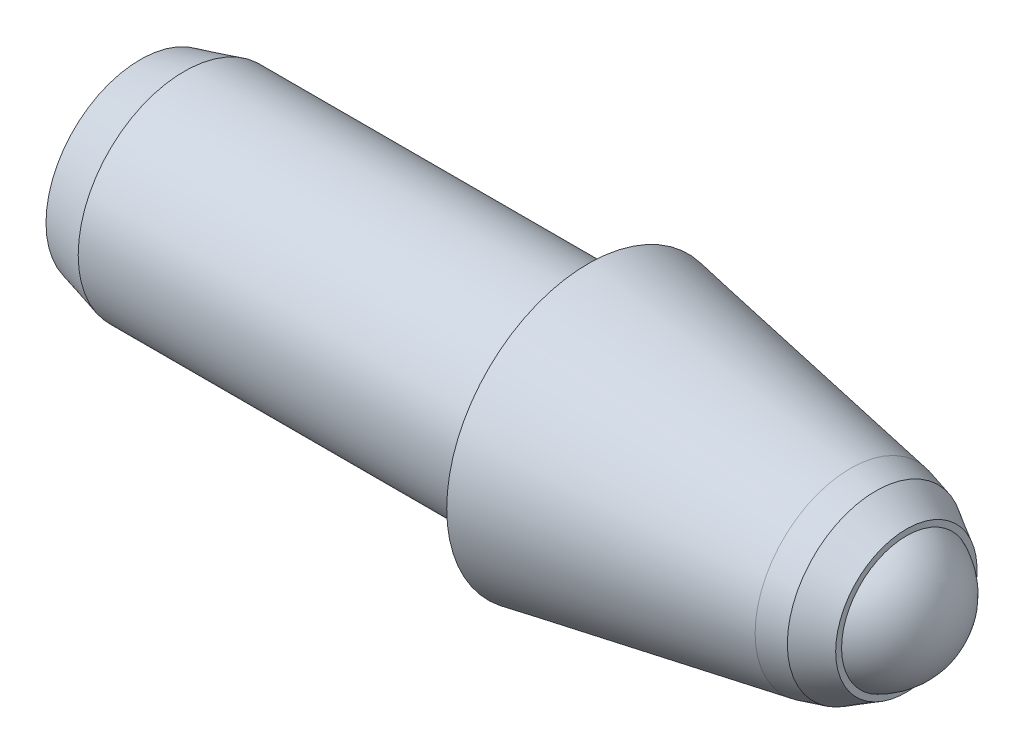
ISO-10303-21;
HEADER;
FILE_DESCRIPTION(('STEP AP214'),'2;1');
FILE_NAME('part.step','',(''),(''),'','','');
FILE_SCHEMA(('AUTOMOTIVE_DESIGN { 1 0 10303 214 1 1 1 1 }'));
ENDSEC;
DATA;
#1=APPLICATION_CONTEXT('core data for automotive mechanical design processes');
#2=APPLICATION_PROTOCOL_DEFINITION('international standard','automotive_design',2000,#1);
#3=PRODUCT_CONTEXT('',#1,'mechanical');
#4=PRODUCT('Part','Part','',(#3));
#5=PRODUCT_RELATED_PRODUCT_CATEGORY('part','',(#4));
#6=PRODUCT_DEFINITION_FORMATION('','',#4);
#7=PRODUCT_DEFINITION_CONTEXT('part definition',#1,'design');
#8=PRODUCT_DEFINITION('design','',#6,#7);
#9=PRODUCT_DEFINITION_SHAPE('','',#8);
#10=(LENGTH_UNIT() NAMED_UNIT(*) SI_UNIT(.MILLI.,.METRE.));
#11=(NAMED_UNIT(*) PLANE_ANGLE_UNIT() SI_UNIT($,.RADIAN.));
#12=(NAMED_UNIT(*) SI_UNIT($,.STERADIAN.) SOLID_ANGLE_UNIT());
#13=UNCERTAINTY_MEASURE_WITH_UNIT(LENGTH_MEASURE(1.E-05),#10,'distance_accuracy_value','');
#14=(GEOMETRIC_REPRESENTATION_CONTEXT(3) GLOBAL_UNCERTAINTY_ASSIGNED_CONTEXT((#13)) GLOBAL_UNIT_ASSIGNED_CONTEXT((#10,
#11,#12)) REPRESENTATION_CONTEXT('',''));
#15=CARTESIAN_POINT('',(0.,0.,0.));
#16=DIRECTION('',(0.,0.,1.));
#17=DIRECTION('',(1.,0.,0.));
#18=AXIS2_PLACEMENT_3D('',#15,#16,#17);
#19=CARTESIAN_POINT('',(6.26,0.,0.));
#20=DIRECTION('',(-1.,0.,0.));
#21=DIRECTION('',(0.,1.,0.));
#22=AXIS2_PLACEMENT_3D('',#19,#20,#21);
#23=SPHERICAL_SURFACE('',#22,0.6);
#24=CARTESIAN_POINT('',(5.66,0.,0.));
#25=VERTEX_POINT('',#24);
#26=VERTEX_LOOP('',#25);
#27=FACE_BOUND('',#26,.T.);
#28=ADVANCED_FACE('F52',(#27),#23,.T.);
#29=CLOSED_SHELL('',(#28));
#30=MANIFOLD_SOLID_BREP('B2',#29);
#31=CARTESIAN_POINT('',(6.02441020488491,0.,0.));
#32=DIRECTION('',(-1.,0.,0.));
#33=DIRECTION('',(0.,0.,1.));
#34=AXIS2_PLACEMENT_3D('',#31,#32,#33);
#35=CONICAL_SURFACE('',#34,0.807776464715544,0.174532925199433);
#36=CARTESIAN_POINT('',(3.8,0.,0.));
#37=DIRECTION('',(-1.,0.,0.));
#38=DIRECTION('',(0.,0.,1.));
#39=AXIS2_PLACEMENT_3D('',#36,#37,#38);
#40=CIRCLE('',#39,1.2);
#41=CARTESIAN_POINT('',(3.8,0.,1.2));
#42=VERTEX_POINT('',#41);
#43=EDGE_CURVE('E51',#42,#42,#40,.T.);
#44=ORIENTED_EDGE('',*,*,#43,.F.);
#45=EDGE_LOOP('',(#44));
#46=FACE_BOUND('',#45,.T.);
#47=CARTESIAN_POINT('',(6.02441020488491,0.,0.));
#48=DIRECTION('',(-1.,0.,0.));
#49=DIRECTION('',(0.,0.,1.));
#50=AXIS2_PLACEMENT_3D('',#47,#48,#49);
#51=CIRCLE('',#50,0.807776464715544);
#52=CARTESIAN_POINT('',(6.02441020488491,0.,0.807776464715544));
#53=VERTEX_POINT('',#52);
#54=EDGE_CURVE('E149',#53,#53,#51,.T.);
#55=ORIENTED_EDGE('',*,*,#54,.T.);
#56=EDGE_LOOP('',(#55));
#57=FACE_BOUND('',#56,.T.);
#58=ADVANCED_FACE('F72',(#46,#57),#35,.T.);
#59=CARTESIAN_POINT('',(3.8,0.9,0.));
#60=DIRECTION('',(1.,0.,0.));
#61=DIRECTION('',(0.,0.,-1.));
#62=AXIS2_PLACEMENT_3D('',#59,#60,#61);
#63=PLANE('',#62);
#64=CARTESIAN_POINT('',(3.8,0.,0.));
#65=DIRECTION('',(-1.,0.,0.));
#66=DIRECTION('',(0.,0.,1.));
#67=AXIS2_PLACEMENT_3D('',#64,#65,#66);
#68=CIRCLE('',#67,0.9);
#69=CARTESIAN_POINT('',(3.8,0.,0.9));
#70=VERTEX_POINT('',#69);
#71=EDGE_CURVE('E79',#70,#70,#68,.T.);
#72=ORIENTED_EDGE('',*,*,#71,.F.);
#73=EDGE_LOOP('',(#72));
#74=FACE_BOUND('',#73,.T.);
#75=ORIENTED_EDGE('',*,*,#43,.T.);
#76=EDGE_LOOP('',(#75));
#77=FACE_BOUND('',#76,.T.);
#78=ADVANCED_FACE('F248',(#74,#77),#63,.F.);
#79=CARTESIAN_POINT('',(-0.1578843458274,0.,0.));
#80=DIRECTION('',(-1.,0.,0.));
#81=DIRECTION('',(0.,0.,1.));
#82=AXIS2_PLACEMENT_3D('',#79,#80,#81);
#83=CYLINDRICAL_SURFACE('',#82,0.9);
#84=CARTESIAN_POINT('',(0.373205080756895,0.,0.));
#85=DIRECTION('',(-1.,0.,0.));
#86=DIRECTION('',(0.,0.,1.));
#87=AXIS2_PLACEMENT_3D('',#84,#85,#86);
#88=CIRCLE('',#87,0.9);
#89=CARTESIAN_POINT('',(0.373205080756895,0.,0.9));
#90=VERTEX_POINT('',#89);
#91=EDGE_CURVE('E85',#90,#90,#88,.T.);
#92=ORIENTED_EDGE('',*,*,#91,.F.);
#93=EDGE_LOOP('',(#92));
#94=FACE_BOUND('',#93,.T.);
#95=ORIENTED_EDGE('',*,*,#71,.T.);
#96=EDGE_LOOP('',(#95));
#97=FACE_BOUND('',#96,.T.);
#98=ADVANCED_FACE('F243',(#94,#97),#83,.T.);
#99=CARTESIAN_POINT('',(0.373205080756895,0.,0.));
#100=DIRECTION('',(1.,0.,0.));
#101=DIRECTION('',(0.,0.,-1.));
#102=AXIS2_PLACEMENT_3D('',#99,#100,#101);
#103=CONICAL_SURFACE('',#102,0.9,0.261799387799143);
#104=CARTESIAN_POINT('',(0.,0.,0.));
#105=DIRECTION('',(-1.,0.,0.));
#106=DIRECTION('',(0.,0.,1.));
#107=AXIS2_PLACEMENT_3D('',#104,#105,#106);
#108=CIRCLE('',#107,0.8);
#109=CARTESIAN_POINT('',(0.,0.,0.8));
#110=VERTEX_POINT('',#109);
#111=EDGE_CURVE('E91',#110,#110,#108,.T.);
#112=ORIENTED_EDGE('',*,*,#111,.F.);
#113=EDGE_LOOP('',(#112));
#114=FACE_BOUND('',#113,.T.);
#115=ORIENTED_EDGE('',*,*,#91,.T.);
#116=EDGE_LOOP('',(#115));
#117=FACE_BOUND('',#116,.T.);
#118=ADVANCED_FACE('F237',(#114,#117),#103,.T.);
#119=CARTESIAN_POINT('',(0.,0.465,0.));
#120=DIRECTION('',(1.,0.,0.));
#121=DIRECTION('',(0.,0.,-1.));
#122=AXIS2_PLACEMENT_3D('',#119,#120,#121);
#123=PLANE('',#122);
#124=CARTESIAN_POINT('',(0.,0.,0.));
#125=DIRECTION('',(-1.,0.,0.));
#126=DIRECTION('',(0.,0.,1.));
#127=AXIS2_PLACEMENT_3D('',#124,#125,#126);
#128=CIRCLE('',#127,0.465);
#129=CARTESIAN_POINT('',(0.,0.,0.465));
#130=VERTEX_POINT('',#129);
#131=EDGE_CURVE('E97',#130,#130,#128,.T.);
#132=ORIENTED_EDGE('',*,*,#131,.F.);
#133=EDGE_LOOP('',(#132));
#134=FACE_BOUND('',#133,.T.);
#135=ORIENTED_EDGE('',*,*,#111,.T.);
#136=EDGE_LOOP('',(#135));
#137=FACE_BOUND('',#136,.T.);
#138=ADVANCED_FACE('F231',(#134,#137),#123,.F.);
#139=CARTESIAN_POINT('',(-0.1578843458274,0.,0.));
#140=DIRECTION('',(-1.,0.,0.));
#141=DIRECTION('',(0.,0.,1.));
#142=AXIS2_PLACEMENT_3D('',#139,#140,#141);
#143=CYLINDRICAL_SURFACE('',#142,0.465);
#144=CARTESIAN_POINT('',(0.6,0.,0.));
#145=DIRECTION('',(-1.,0.,0.));
#146=DIRECTION('',(0.,0.,1.));
#147=AXIS2_PLACEMENT_3D('',#144,#145,#146);
#148=CIRCLE('',#147,0.465);
#149=CARTESIAN_POINT('',(0.6,0.,0.465));
#150=VERTEX_POINT('',#149);
#151=EDGE_CURVE('E101',#150,#150,#148,.T.);
#152=ORIENTED_EDGE('',*,*,#151,.F.);
#153=EDGE_LOOP('',(#152));
#154=FACE_BOUND('',#153,.T.);
#155=ORIENTED_EDGE('',*,*,#131,.T.);
#156=EDGE_LOOP('',(#155));
#157=FACE_BOUND('',#156,.T.);
#158=ADVANCED_FACE('F225',(#154,#157),#143,.F.);
#159=CARTESIAN_POINT('',(0.6,0.,0.));
#160=DIRECTION('',(-1.,0.,0.));
#161=DIRECTION('',(0.,0.,1.));
#162=AXIS2_PLACEMENT_3D('',#159,#160,#161);
#163=CONICAL_SURFACE('',#162,0.465,0.78539816339745);
#164=CARTESIAN_POINT('',(0.615,0.,0.));
#165=DIRECTION('',(-1.,0.,0.));
#166=DIRECTION('',(0.,0.,1.));
#167=AXIS2_PLACEMENT_3D('',#164,#165,#166);
#168=CIRCLE('',#167,0.45);
#169=CARTESIAN_POINT('',(0.615,0.,0.45));
#170=VERTEX_POINT('',#169);
#171=EDGE_CURVE('E105',#170,#170,#168,.T.);
#172=ORIENTED_EDGE('',*,*,#171,.F.);
#173=EDGE_LOOP('',(#172));
#174=FACE_BOUND('',#173,.T.);
#175=ORIENTED_EDGE('',*,*,#151,.T.);
#176=EDGE_LOOP('',(#175));
#177=FACE_BOUND('',#176,.T.);
#178=ADVANCED_FACE('F219',(#174,#177),#163,.F.);
#179=CARTESIAN_POINT('',(-0.1578843458274,0.,0.));
#180=DIRECTION('',(-1.,0.,0.));
#181=DIRECTION('',(0.,0.,1.));
#182=AXIS2_PLACEMENT_3D('',#179,#180,#181);
#183=CYLINDRICAL_SURFACE('',#182,0.45);
#184=CARTESIAN_POINT('',(3.,0.,0.));
#185=DIRECTION('',(-1.,0.,0.));
#186=DIRECTION('',(0.,0.,1.));
#187=AXIS2_PLACEMENT_3D('',#184,#185,#186);
#188=CIRCLE('',#187,0.45);
#189=CARTESIAN_POINT('',(3.,0.,0.45));
#190=VERTEX_POINT('',#189);
#191=EDGE_CURVE('E109',#190,#190,#188,.T.);
#192=ORIENTED_EDGE('',*,*,#191,.F.);
#193=EDGE_LOOP('',(#192));
#194=FACE_BOUND('',#193,.T.);
#195=ORIENTED_EDGE('',*,*,#171,.T.);
#196=EDGE_LOOP('',(#195));
#197=FACE_BOUND('',#196,.T.);
#198=ADVANCED_FACE('F213',(#194,#197),#183,.F.);
#199=CARTESIAN_POINT('',(3.,0.,0.));
#200=DIRECTION('',(-1.,0.,0.));
#201=DIRECTION('',(0.,0.,1.));
#202=AXIS2_PLACEMENT_3D('',#199,#200,#201);
#203=CONICAL_SURFACE('',#202,0.45,1.0471975511966);
#204=CARTESIAN_POINT('',(3.02886751345948,0.,0.));
#205=DIRECTION('',(-1.,0.,0.));
#206=DIRECTION('',(0.,0.,1.));
#207=AXIS2_PLACEMENT_3D('',#204,#205,#206);
#208=CIRCLE('',#207,0.4);
#209=CARTESIAN_POINT('',(3.02886751345948,0.,0.4));
#210=VERTEX_POINT('',#209);
#211=EDGE_CURVE('E113',#210,#210,#208,.T.);
#212=ORIENTED_EDGE('',*,*,#211,.F.);
#213=EDGE_LOOP('',(#212));
#214=FACE_BOUND('',#213,.T.);
#215=ORIENTED_EDGE('',*,*,#191,.T.);
#216=EDGE_LOOP('',(#215));
#217=FACE_BOUND('',#216,.T.);
#218=ADVANCED_FACE('F207',(#214,#217),#203,.F.);
#219=CARTESIAN_POINT('',(-0.1578843458274,0.,0.));
#220=DIRECTION('',(-1.,0.,0.));
#221=DIRECTION('',(0.,0.,1.));
#222=AXIS2_PLACEMENT_3D('',#219,#220,#221);
#223=CYLINDRICAL_SURFACE('',#222,0.4);
#224=CARTESIAN_POINT('',(5.,0.,0.));
#225=DIRECTION('',(-1.,0.,0.));
#226=DIRECTION('',(0.,0.,1.));
#227=AXIS2_PLACEMENT_3D('',#224,#225,#226);
#228=CIRCLE('',#227,0.4);
#229=CARTESIAN_POINT('',(5.,0.,0.4));
#230=VERTEX_POINT('',#229);
#231=EDGE_CURVE('E117',#230,#230,#228,.T.);
#232=ORIENTED_EDGE('',*,*,#231,.F.);
#233=EDGE_LOOP('',(#232));
#234=FACE_BOUND('',#233,.T.);
#235=ORIENTED_EDGE('',*,*,#211,.T.);
#236=EDGE_LOOP('',(#235));
#237=FACE_BOUND('',#236,.T.);
#238=ADVANCED_FACE('F201',(#234,#237),#223,.F.);
#239=CARTESIAN_POINT('',(5.,0.,0.));
#240=DIRECTION('',(-1.,0.,0.));
#241=DIRECTION('',(0.,0.,1.));
#242=AXIS2_PLACEMENT_3D('',#239,#240,#241);
#243=CONICAL_SURFACE('',#242,0.4,1.04719755119659);
#244=CARTESIAN_POINT('',(5.02886751345948,0.,0.));
#245=DIRECTION('',(-1.,0.,0.));
#246=DIRECTION('',(0.,0.,1.));
#247=AXIS2_PLACEMENT_3D('',#244,#245,#246);
#248=CIRCLE('',#247,0.35);
#249=CARTESIAN_POINT('',(5.02886751345948,0.,0.35));
#250=VERTEX_POINT('',#249);
#251=EDGE_CURVE('E121',#250,#250,#248,.T.);
#252=ORIENTED_EDGE('',*,*,#251,.F.);
#253=EDGE_LOOP('',(#252));
#254=FACE_BOUND('',#253,.T.);
#255=ORIENTED_EDGE('',*,*,#231,.T.);
#256=EDGE_LOOP('',(#255));
#257=FACE_BOUND('',#256,.T.);
#258=ADVANCED_FACE('F195',(#254,#257),#243,.F.);
#259=CARTESIAN_POINT('',(-0.1578843458274,0.,0.));
#260=DIRECTION('',(-1.,0.,0.));
#261=DIRECTION('',(0.,0.,1.));
#262=AXIS2_PLACEMENT_3D('',#259,#260,#261);
#263=CYLINDRICAL_SURFACE('',#262,0.35);
#264=CARTESIAN_POINT('',(5.76147186257614,0.,0.));
#265=DIRECTION('',(-1.,0.,0.));
#266=DIRECTION('',(0.,0.,1.));
#267=AXIS2_PLACEMENT_3D('',#264,#265,#266);
#268=CIRCLE('',#267,0.35);
#269=CARTESIAN_POINT('',(5.76147186257614,0.,0.35));
#270=VERTEX_POINT('',#269);
#271=EDGE_CURVE('E125',#270,#270,#268,.T.);
#272=ORIENTED_EDGE('',*,*,#271,.F.);
#273=EDGE_LOOP('',(#272));
#274=FACE_BOUND('',#273,.T.);
#275=ORIENTED_EDGE('',*,*,#251,.T.);
#276=EDGE_LOOP('',(#275));
#277=FACE_BOUND('',#276,.T.);
#278=ADVANCED_FACE('F189',(#274,#277),#263,.F.);
#279=CARTESIAN_POINT('',(5.76147186257614,0.,0.));
#280=DIRECTION('',(1.,0.,0.));
#281=DIRECTION('',(0.,0.,-1.));
#282=AXIS2_PLACEMENT_3D('',#279,#280,#281);
#283=CONICAL_SURFACE('',#282,0.35,0.785398163397444);
#284=CARTESIAN_POINT('',(6.01147186257614,0.,0.));
#285=DIRECTION('',(-1.,0.,0.));
#286=DIRECTION('',(0.,0.,1.));
#287=AXIS2_PLACEMENT_3D('',#284,#285,#286);
#288=CIRCLE('',#287,0.6);
#289=CARTESIAN_POINT('',(6.01147186257614,0.,0.6));
#290=VERTEX_POINT('',#289);
#291=EDGE_CURVE('E129',#290,#290,#288,.T.);
#292=ORIENTED_EDGE('',*,*,#291,.F.);
#293=EDGE_LOOP('',(#292));
#294=FACE_BOUND('',#293,.T.);
#295=ORIENTED_EDGE('',*,*,#271,.T.);
#296=EDGE_LOOP('',(#295));
#297=FACE_BOUND('',#296,.T.);
#298=ADVANCED_FACE('F183',(#294,#297),#283,.F.);
#299=CARTESIAN_POINT('',(-0.1578843458274,0.,0.));
#300=DIRECTION('',(-1.,0.,0.));
#301=DIRECTION('',(0.,0.,1.));
#302=AXIS2_PLACEMENT_3D('',#299,#300,#301);
#303=CYLINDRICAL_SURFACE('',#302,0.6);
#304=CARTESIAN_POINT('',(6.26,0.,0.));
#305=DIRECTION('',(-1.,0.,0.));
#306=DIRECTION('',(0.,0.,1.));
#307=AXIS2_PLACEMENT_3D('',#304,#305,#306);
#308=CIRCLE('',#307,0.6);
#309=CARTESIAN_POINT('',(6.26,0.,0.6));
#310=VERTEX_POINT('',#309);
#311=EDGE_CURVE('E133',#310,#310,#308,.T.);
#312=ORIENTED_EDGE('',*,*,#311,.F.);
#313=EDGE_LOOP('',(#312));
#314=FACE_BOUND('',#313,.T.);
#315=ORIENTED_EDGE('',*,*,#291,.T.);
#316=EDGE_LOOP('',(#315));
#317=FACE_BOUND('',#316,.T.);
#318=ADVANCED_FACE('F177',(#314,#317),#303,.F.);
#319=CARTESIAN_POINT('',(6.26,0.,0.));
#320=DIRECTION('',(-1.,0.,0.));
#321=DIRECTION('',(0.,1.,0.));
#322=AXIS2_PLACEMENT_3D('',#319,#320,#321);
#323=SPHERICAL_SURFACE('',#322,0.599999999999999);
#324=CARTESIAN_POINT('',(6.5,0.,0.));
#325=DIRECTION('',(-1.,0.,0.));
#326=DIRECTION('',(0.,0.,1.));
#327=AXIS2_PLACEMENT_3D('',#324,#325,#326);
#328=CIRCLE('',#327,0.5499090833947);
#329=CARTESIAN_POINT('',(6.5,0.,0.5499090833947));
#330=VERTEX_POINT('',#329);
#331=EDGE_CURVE('E137',#330,#330,#328,.T.);
#332=ORIENTED_EDGE('',*,*,#331,.F.);
#333=EDGE_LOOP('',(#332));
#334=FACE_BOUND('',#333,.T.);
#335=ORIENTED_EDGE('',*,*,#311,.T.);
#336=EDGE_LOOP('',(#335));
#337=FACE_BOUND('',#336,.T.);
#338=ADVANCED_FACE('F171',(#334,#337),#323,.F.);
#339=CARTESIAN_POINT('',(6.5,0.599909083394701,0.));
#340=DIRECTION('',(-1.,0.,0.));
#341=DIRECTION('',(0.,0.,1.));
#342=AXIS2_PLACEMENT_3D('',#339,#340,#341);
#343=PLANE('',#342);
#344=CARTESIAN_POINT('',(6.5,0.,0.));
#345=DIRECTION('',(-1.,0.,0.));
#346=DIRECTION('',(0.,0.,1.));
#347=AXIS2_PLACEMENT_3D('',#344,#345,#346);
#348=CIRCLE('',#347,0.599909083394701);
#349=CARTESIAN_POINT('',(6.5,0.,0.599909083394701));
#350=VERTEX_POINT('',#349);
#351=EDGE_CURVE('E141',#350,#350,#348,.T.);
#352=ORIENTED_EDGE('',*,*,#351,.F.);
#353=EDGE_LOOP('',(#352));
#354=FACE_BOUND('',#353,.T.);
#355=ORIENTED_EDGE('',*,*,#331,.T.);
#356=EDGE_LOOP('',(#355));
#357=FACE_BOUND('',#356,.T.);
#358=ADVANCED_FACE('F165',(#354,#357),#343,.F.);
#359=CARTESIAN_POINT('',(6.5,0.,0.));
#360=DIRECTION('',(-1.,0.,0.));
#361=DIRECTION('',(0.,0.,1.));
#362=AXIS2_PLACEMENT_3D('',#359,#360,#361);
#363=CONICAL_SURFACE('',#362,0.599909083394701,0.523598775598292);
#364=CARTESIAN_POINT('',(6.24003490668503,0.,0.));
#365=DIRECTION('',(-1.,0.,0.));
#366=DIRECTION('',(0.,0.,1.));
#367=AXIS2_PLACEMENT_3D('',#364,#365,#366);
#368=CIRCLE('',#367,0.75);
#369=CARTESIAN_POINT('',(6.24003490668503,0.,0.75));
#370=VERTEX_POINT('',#369);
#371=EDGE_CURVE('E145',#370,#370,#368,.T.);
#372=ORIENTED_EDGE('',*,*,#371,.F.);
#373=EDGE_LOOP('',(#372));
#374=FACE_BOUND('',#373,.T.);
#375=ORIENTED_EDGE('',*,*,#351,.T.);
#376=EDGE_LOOP('',(#375));
#377=FACE_BOUND('',#376,.T.);
#378=ADVANCED_FACE('F159',(#374,#377),#363,.T.);
#379=CARTESIAN_POINT('',(6.24003490668503,0.,0.));
#380=DIRECTION('',(-1.,0.,0.));
#381=DIRECTION('',(0.,0.,1.));
#382=AXIS2_PLACEMENT_3D('',#379,#380,#381);
#383=CONICAL_SURFACE('',#382,0.75,0.261799387799149);
#384=ORIENTED_EDGE('',*,*,#54,.F.);
#385=EDGE_LOOP('',(#384));
#386=FACE_BOUND('',#385,.T.);
#387=ORIENTED_EDGE('',*,*,#371,.T.);
#388=EDGE_LOOP('',(#387));
#389=FACE_BOUND('',#388,.T.);
#390=ADVANCED_FACE('F156',(#386,#389),#383,.T.);
#391=CLOSED_SHELL('',(#58,#78,#98,#118,#138,#158,#178,#198,#218,#238,#258,#278,#298,#318,#338,
#358,#378,#390));
#392=MANIFOLD_SOLID_BREP('B7',#391);
#393=ADVANCED_BREP_SHAPE_REPRESENTATION('',(#18,#30,#392),#14);
#394=SHAPE_DEFINITION_REPRESENTATION(#9,#393);
ENDSEC;
END-ISO-10303-21;
